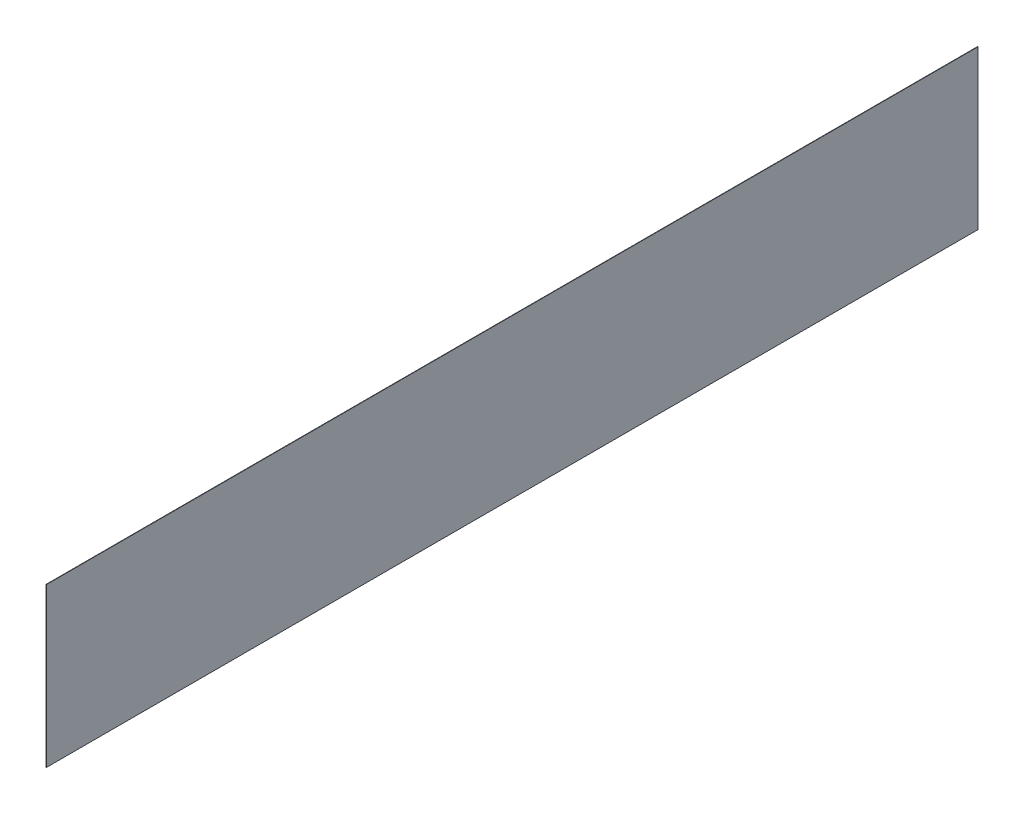
ISO-10303-21;
HEADER;
FILE_DESCRIPTION(('STEP AP214'),'2;1');
FILE_NAME('part.step','',(''),(''),'','','');
FILE_SCHEMA(('AUTOMOTIVE_DESIGN { 1 0 10303 214 1 1 1 1 }'));
ENDSEC;
DATA;
#1=APPLICATION_CONTEXT('core data for automotive mechanical design processes');
#2=APPLICATION_PROTOCOL_DEFINITION('international standard','automotive_design',2000,#1);
#3=PRODUCT_CONTEXT('',#1,'mechanical');
#4=PRODUCT('Part','Part','',(#3));
#5=PRODUCT_RELATED_PRODUCT_CATEGORY('part','',(#4));
#6=PRODUCT_DEFINITION_FORMATION('','',#4);
#7=PRODUCT_DEFINITION_CONTEXT('part definition',#1,'design');
#8=PRODUCT_DEFINITION('design','',#6,#7);
#9=PRODUCT_DEFINITION_SHAPE('','',#8);
#10=(LENGTH_UNIT() NAMED_UNIT(*) SI_UNIT(.MILLI.,.METRE.));
#11=(NAMED_UNIT(*) PLANE_ANGLE_UNIT() SI_UNIT($,.RADIAN.));
#12=(NAMED_UNIT(*) SI_UNIT($,.STERADIAN.) SOLID_ANGLE_UNIT());
#13=UNCERTAINTY_MEASURE_WITH_UNIT(LENGTH_MEASURE(1.E-05),#10,'distance_accuracy_value','');
#14=(GEOMETRIC_REPRESENTATION_CONTEXT(3) GLOBAL_UNCERTAINTY_ASSIGNED_CONTEXT((#13)) GLOBAL_UNIT_ASSIGNED_CONTEXT((#10,
#11,#12)) REPRESENTATION_CONTEXT('',''));
#15=CARTESIAN_POINT('',(0.,0.,0.));
#16=DIRECTION('',(0.,0.,1.));
#17=DIRECTION('',(1.,0.,0.));
#18=AXIS2_PLACEMENT_3D('',#15,#16,#17);
#19=CARTESIAN_POINT('',(-126.327,-60.,150.));
#20=DIRECTION('',(0.,0.,1.));
#21=DIRECTION('',(1.,0.,0.));
#22=AXIS2_PLACEMENT_3D('',#19,#20,#21);
#23=PLANE('',#22);
#24=DIRECTION('',(-1.,0.,0.));
#25=VECTOR('',#24,1.);
#26=CARTESIAN_POINT('',(-116.327,12.,150.));
#27=LINE('',#26,#25);
#28=CARTESIAN_POINT('',(-126.2,12.,150.));
#29=VERTEX_POINT('',#28);
#30=CARTESIAN_POINT('',(-126.327,12.,150.));
#31=VERTEX_POINT('',#30);
#32=EDGE_CURVE('E93',#29,#31,#27,.T.);
#33=ORIENTED_EDGE('',*,*,#32,.F.);
#34=DIRECTION('',(0.,-1.,0.));
#35=VECTOR('',#34,1.);
#36=CARTESIAN_POINT('',(-126.2,-60.,150.));
#37=LINE('',#36,#35);
#38=CARTESIAN_POINT('',(-126.2,63.,150.));
#39=VERTEX_POINT('',#38);
#40=EDGE_CURVE('E91',#39,#29,#37,.T.);
#41=ORIENTED_EDGE('',*,*,#40,.F.);
#42=DIRECTION('',(1.,0.,0.));
#43=VECTOR('',#42,1.);
#44=CARTESIAN_POINT('',(-126.327,63.,150.));
#45=LINE('',#44,#43);
#46=CARTESIAN_POINT('',(-126.327,63.,150.));
#47=VERTEX_POINT('',#46);
#48=EDGE_CURVE('E53',#47,#39,#45,.T.);
#49=ORIENTED_EDGE('',*,*,#48,.F.);
#50=DIRECTION('',(0.,-1.,0.));
#51=VECTOR('',#50,1.);
#52=CARTESIAN_POINT('',(-126.327,-60.,150.));
#53=LINE('',#52,#51);
#54=EDGE_CURVE('E102',#47,#31,#53,.T.);
#55=ORIENTED_EDGE('',*,*,#54,.T.);
#56=EDGE_LOOP('',(#33,#41,#49,#55));
#57=FACE_BOUND('',#56,.T.);
#58=ADVANCED_FACE('F45',(#57),#23,.T.);
#59=CARTESIAN_POINT('',(-126.327,63.,150.));
#60=DIRECTION('',(0.,1.,0.));
#61=DIRECTION('',(0.,0.,1.));
#62=AXIS2_PLACEMENT_3D('',#59,#60,#61);
#63=PLANE('',#62);
#64=DIRECTION('',(0.,0.,1.));
#65=VECTOR('',#64,1.);
#66=CARTESIAN_POINT('',(-126.2,63.,150.));
#67=LINE('',#66,#65);
#68=CARTESIAN_POINT('',(-126.2,63.,-150.));
#69=VERTEX_POINT('',#68);
#70=EDGE_CURVE('E83',#69,#39,#67,.T.);
#71=ORIENTED_EDGE('',*,*,#70,.F.);
#72=DIRECTION('',(1.,0.,0.));
#73=VECTOR('',#72,1.);
#74=CARTESIAN_POINT('',(-126.327,63.,-150.));
#75=LINE('',#74,#73);
#76=CARTESIAN_POINT('',(-126.327,63.,-150.));
#77=VERTEX_POINT('',#76);
#78=EDGE_CURVE('E87',#77,#69,#75,.T.);
#79=ORIENTED_EDGE('',*,*,#78,.F.);
#80=DIRECTION('',(0.,0.,1.));
#81=VECTOR('',#80,1.);
#82=CARTESIAN_POINT('',(-126.327,63.,150.));
#83=LINE('',#82,#81);
#84=EDGE_CURVE('E85',#77,#47,#83,.T.);
#85=ORIENTED_EDGE('',*,*,#84,.T.);
#86=ORIENTED_EDGE('',*,*,#48,.T.);
#87=EDGE_LOOP('',(#71,#79,#85,#86));
#88=FACE_BOUND('',#87,.T.);
#89=ADVANCED_FACE('F80',(#88),#63,.T.);
#90=CARTESIAN_POINT('',(-126.327,-60.,-150.));
#91=DIRECTION('',(0.,0.,-1.));
#92=DIRECTION('',(-1.,0.,0.));
#93=AXIS2_PLACEMENT_3D('',#90,#91,#92);
#94=PLANE('',#93);
#95=DIRECTION('',(-1.,0.,0.));
#96=VECTOR('',#95,1.);
#97=CARTESIAN_POINT('',(-116.327,12.,-150.));
#98=LINE('',#97,#96);
#99=CARTESIAN_POINT('',(-126.2,12.,-150.));
#100=VERTEX_POINT('',#99);
#101=CARTESIAN_POINT('',(-126.327,12.,-150.));
#102=VERTEX_POINT('',#101);
#103=EDGE_CURVE('E60',#100,#102,#98,.T.);
#104=ORIENTED_EDGE('',*,*,#103,.T.);
#105=DIRECTION('',(0.,1.,0.));
#106=VECTOR('',#105,1.);
#107=CARTESIAN_POINT('',(-126.327,-60.,-150.));
#108=LINE('',#107,#106);
#109=EDGE_CURVE('E106',#102,#77,#108,.T.);
#110=ORIENTED_EDGE('',*,*,#109,.T.);
#111=ORIENTED_EDGE('',*,*,#78,.T.);
#112=DIRECTION('',(0.,1.,0.));
#113=VECTOR('',#112,1.);
#114=CARTESIAN_POINT('',(-126.2,-60.,-150.));
#115=LINE('',#114,#113);
#116=EDGE_CURVE('E96',#100,#69,#115,.T.);
#117=ORIENTED_EDGE('',*,*,#116,.F.);
#118=EDGE_LOOP('',(#104,#110,#111,#117));
#119=FACE_BOUND('',#118,.T.);
#120=ADVANCED_FACE('F129',(#119),#94,.T.);
#121=CARTESIAN_POINT('',(-126.327,0.,0.));
#122=DIRECTION('',(-1.,0.,0.));
#123=DIRECTION('',(0.,0.,1.));
#124=AXIS2_PLACEMENT_3D('',#121,#122,#123);
#125=PLANE('',#124);
#126=DIRECTION('',(0.,0.,-1.));
#127=VECTOR('',#126,1.);
#128=CARTESIAN_POINT('',(-126.327,12.,-150.));
#129=LINE('',#128,#127);
#130=EDGE_CURVE('E118',#31,#102,#129,.T.);
#131=ORIENTED_EDGE('',*,*,#130,.F.);
#132=ORIENTED_EDGE('',*,*,#54,.F.);
#133=ORIENTED_EDGE('',*,*,#84,.F.);
#134=ORIENTED_EDGE('',*,*,#109,.F.);
#135=EDGE_LOOP('',(#131,#132,#133,#134));
#136=FACE_BOUND('',#135,.T.);
#137=ADVANCED_FACE('F130',(#136),#125,.T.);
#138=CARTESIAN_POINT('',(-126.2,0.,0.));
#139=DIRECTION('',(-1.,0.,0.));
#140=DIRECTION('',(0.,0.,1.));
#141=AXIS2_PLACEMENT_3D('',#138,#139,#140);
#142=PLANE('',#141);
#143=ORIENTED_EDGE('',*,*,#40,.T.);
#144=DIRECTION('',(0.,0.,-1.));
#145=VECTOR('',#144,1.);
#146=CARTESIAN_POINT('',(-126.2,12.,0.));
#147=LINE('',#146,#145);
#148=EDGE_CURVE('E11',#29,#100,#147,.T.);
#149=ORIENTED_EDGE('',*,*,#148,.T.);
#150=ORIENTED_EDGE('',*,*,#116,.T.);
#151=ORIENTED_EDGE('',*,*,#70,.T.);
#152=EDGE_LOOP('',(#143,#149,#150,#151));
#153=FACE_BOUND('',#152,.T.);
#154=ADVANCED_FACE('F98',(#153),#142,.F.);
#155=CARTESIAN_POINT('',(-116.327,12.,-150.));
#156=DIRECTION('',(0.,1.,0.));
#157=DIRECTION('',(0.,0.,1.));
#158=AXIS2_PLACEMENT_3D('',#155,#156,#157);
#159=PLANE('',#158);
#160=ORIENTED_EDGE('',*,*,#32,.T.);
#161=ORIENTED_EDGE('',*,*,#130,.T.);
#162=ORIENTED_EDGE('',*,*,#103,.F.);
#163=ORIENTED_EDGE('',*,*,#148,.F.);
#164=EDGE_LOOP('',(#160,#161,#162,#163));
#165=FACE_BOUND('',#164,.T.);
#166=ADVANCED_FACE('F124',(#165),#159,.F.);
#167=CLOSED_SHELL('',(#58,#89,#120,#137,#154,#166));
#168=MANIFOLD_SOLID_BREP('B2',#167);
#169=ADVANCED_BREP_SHAPE_REPRESENTATION('',(#18,#168),#14);
#170=SHAPE_DEFINITION_REPRESENTATION(#9,#169);
ENDSEC;
END-ISO-10303-21;
